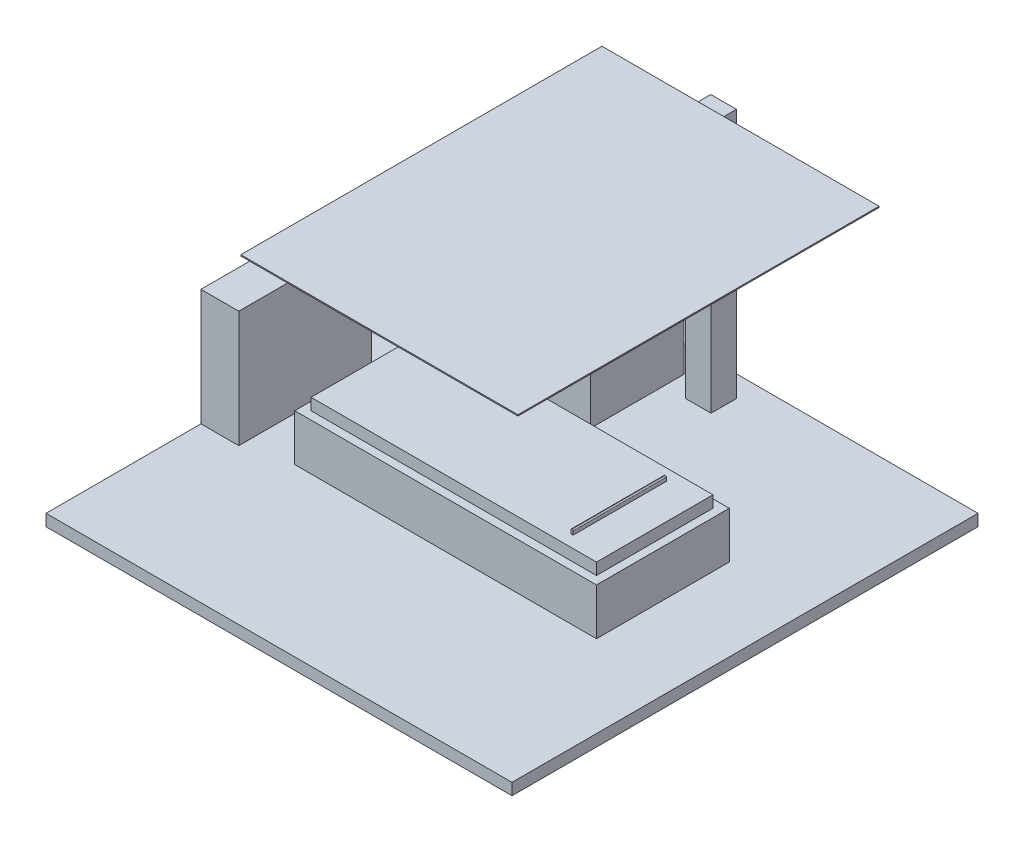
ISO-10303-21;
HEADER;
FILE_DESCRIPTION(('STEP AP214'),'2;1');
FILE_NAME('part.step','',(''),(''),'','','');
FILE_SCHEMA(('AUTOMOTIVE_DESIGN { 1 0 10303 214 1 1 1 1 }'));
ENDSEC;
DATA;
#1=APPLICATION_CONTEXT('core data for automotive mechanical design processes');
#2=APPLICATION_PROTOCOL_DEFINITION('international standard','automotive_design',2000,#1);
#3=PRODUCT_CONTEXT('',#1,'mechanical');
#4=PRODUCT('Part','Part','',(#3));
#5=PRODUCT_RELATED_PRODUCT_CATEGORY('part','',(#4));
#6=PRODUCT_DEFINITION_FORMATION('','',#4);
#7=PRODUCT_DEFINITION_CONTEXT('part definition',#1,'design');
#8=PRODUCT_DEFINITION('design','',#6,#7);
#9=PRODUCT_DEFINITION_SHAPE('','',#8);
#10=(LENGTH_UNIT() NAMED_UNIT(*) SI_UNIT(.MILLI.,.METRE.));
#11=(NAMED_UNIT(*) PLANE_ANGLE_UNIT() SI_UNIT($,.RADIAN.));
#12=(NAMED_UNIT(*) SI_UNIT($,.STERADIAN.) SOLID_ANGLE_UNIT());
#13=UNCERTAINTY_MEASURE_WITH_UNIT(LENGTH_MEASURE(1.E-05),#10,'distance_accuracy_value','');
#14=(GEOMETRIC_REPRESENTATION_CONTEXT(3) GLOBAL_UNCERTAINTY_ASSIGNED_CONTEXT((#13)) GLOBAL_UNIT_ASSIGNED_CONTEXT((#10,
#11,#12)) REPRESENTATION_CONTEXT('',''));
#15=CARTESIAN_POINT('',(0.,0.,0.));
#16=DIRECTION('',(0.,0.,1.));
#17=DIRECTION('',(1.,0.,0.));
#18=AXIS2_PLACEMENT_3D('',#15,#16,#17);
#19=CARTESIAN_POINT('',(0.,600.,0.));
#20=DIRECTION('',(0.,-1.,0.));
#21=DIRECTION('',(0.,0.,-1.));
#22=AXIS2_PLACEMENT_3D('',#19,#20,#21);
#23=PLANE('',#22);
#24=DIRECTION('',(0.,0.,-1.));
#25=VECTOR('',#24,1.);
#26=CARTESIAN_POINT('',(1225.,600.,500.));
#27=LINE('',#26,#25);
#28=CARTESIAN_POINT('',(1225.,600.,500.));
#29=VERTEX_POINT('',#28);
#30=CARTESIAN_POINT('',(1225.,600.,-500.));
#31=VERTEX_POINT('',#30);
#32=EDGE_CURVE('E420',#29,#31,#27,.T.);
#33=ORIENTED_EDGE('',*,*,#32,.T.);
#34=DIRECTION('',(-1.,0.,0.));
#35=VECTOR('',#34,1.);
#36=CARTESIAN_POINT('',(-1225.,600.,-500.));
#37=LINE('',#36,#35);
#38=CARTESIAN_POINT('',(-1225.,600.,-500.));
#39=VERTEX_POINT('',#38);
#40=EDGE_CURVE('E423',#31,#39,#37,.T.);
#41=ORIENTED_EDGE('',*,*,#40,.T.);
#42=DIRECTION('',(0.,0.,1.));
#43=VECTOR('',#42,1.);
#44=CARTESIAN_POINT('',(-1225.,600.,500.));
#45=LINE('',#44,#43);
#46=CARTESIAN_POINT('',(-1225.,600.,500.));
#47=VERTEX_POINT('',#46);
#48=EDGE_CURVE('E426',#39,#47,#45,.T.);
#49=ORIENTED_EDGE('',*,*,#48,.T.);
#50=DIRECTION('',(1.,0.,0.));
#51=VECTOR('',#50,1.);
#52=CARTESIAN_POINT('',(-1225.,600.,500.));
#53=LINE('',#52,#51);
#54=EDGE_CURVE('E428',#47,#29,#53,.T.);
#55=ORIENTED_EDGE('',*,*,#54,.T.);
#56=EDGE_LOOP('',(#33,#41,#49,#55));
#57=FACE_BOUND('',#56,.T.);
#58=DIRECTION('',(0.,0.,-1.));
#59=VECTOR('',#58,1.);
#60=CARTESIAN_POINT('',(925.,600.,-400.));
#61=LINE('',#60,#59);
#62=CARTESIAN_POINT('',(925.,600.,400.));
#63=VERTEX_POINT('',#62);
#64=CARTESIAN_POINT('',(925.,600.,-400.));
#65=VERTEX_POINT('',#64);
#66=EDGE_CURVE('E260',#63,#65,#61,.T.);
#67=ORIENTED_EDGE('',*,*,#66,.F.);
#68=DIRECTION('',(1.,0.,0.));
#69=VECTOR('',#68,1.);
#70=CARTESIAN_POINT('',(925.,600.,400.));
#71=LINE('',#70,#69);
#72=CARTESIAN_POINT('',(905.,600.,400.));
#73=VERTEX_POINT('',#72);
#74=EDGE_CURVE('E265',#73,#63,#71,.T.);
#75=ORIENTED_EDGE('',*,*,#74,.F.);
#76=DIRECTION('',(0.,0.,1.));
#77=VECTOR('',#76,1.);
#78=CARTESIAN_POINT('',(905.,600.,-400.));
#79=LINE('',#78,#77);
#80=CARTESIAN_POINT('',(905.,600.,-400.));
#81=VERTEX_POINT('',#80);
#82=EDGE_CURVE('E276',#81,#73,#79,.T.);
#83=ORIENTED_EDGE('',*,*,#82,.F.);
#84=DIRECTION('',(-1.,0.,0.));
#85=VECTOR('',#84,1.);
#86=CARTESIAN_POINT('',(925.,600.,-400.));
#87=LINE('',#86,#85);
#88=EDGE_CURVE('E273',#65,#81,#87,.T.);
#89=ORIENTED_EDGE('',*,*,#88,.F.);
#90=EDGE_LOOP('',(#67,#75,#83,#89));
#91=FACE_BOUND('',#90,.T.);
#92=ADVANCED_FACE('F38',(#57,#91),#23,.F.);
#93=CARTESIAN_POINT('',(0.,2250.,0.));
#94=DIRECTION('',(0.,1.,0.));
#95=DIRECTION('',(0.,0.,1.));
#96=AXIS2_PLACEMENT_3D('',#93,#94,#95);
#97=PLANE('',#96);
#98=DIRECTION('',(0.,0.,1.));
#99=VECTOR('',#98,1.);
#100=CARTESIAN_POINT('',(-110.276526212385,2250.,-1816.32419728227));
#101=LINE('',#100,#99);
#102=CARTESIAN_POINT('',(-110.276526212385,2250.,-1816.32419728227));
#103=VERTEX_POINT('',#102);
#104=CARTESIAN_POINT('',(-110.276526212385,2250.,-1698.22211195436));
#105=VERTEX_POINT('',#104);
#106=EDGE_CURVE('E328',#103,#105,#101,.T.);
#107=ORIENTED_EDGE('',*,*,#106,.T.);
#108=DIRECTION('',(1.,0.,0.));
#109=VECTOR('',#108,1.);
#110=CARTESIAN_POINT('',(1452.73793324483,2250.,-1698.22211195436));
#111=LINE('',#110,#109);
#112=CARTESIAN_POINT('',(110.276526212385,2250.,-1698.22211195436));
#113=VERTEX_POINT('',#112);
#114=EDGE_CURVE('E312',#105,#113,#111,.T.);
#115=ORIENTED_EDGE('',*,*,#114,.T.);
#116=DIRECTION('',(0.,0.,-1.));
#117=VECTOR('',#116,1.);
#118=CARTESIAN_POINT('',(110.276526212385,2250.,-1816.32419728227));
#119=LINE('',#118,#117);
#120=CARTESIAN_POINT('',(110.276526212385,2250.,-1816.32419728227));
#121=VERTEX_POINT('',#120);
#122=EDGE_CURVE('E325',#113,#121,#119,.T.);
#123=ORIENTED_EDGE('',*,*,#122,.T.);
#124=DIRECTION('',(-1.,0.,0.));
#125=VECTOR('',#124,1.);
#126=CARTESIAN_POINT('',(-110.276526212385,2250.,-1816.32419728227));
#127=LINE('',#126,#125);
#128=EDGE_CURVE('E324',#121,#103,#127,.T.);
#129=ORIENTED_EDGE('',*,*,#128,.T.);
#130=EDGE_LOOP('',(#107,#115,#123,#129));
#131=FACE_BOUND('',#130,.T.);
#132=ADVANCED_FACE('F544',(#131),#97,.T.);
#133=CARTESIAN_POINT('',(0.,100.,0.));
#134=DIRECTION('',(0.,-1.,0.));
#135=DIRECTION('',(0.,0.,-1.));
#136=AXIS2_PLACEMENT_3D('',#133,#134,#135);
#137=PLANE('',#136);
#138=DIRECTION('',(1.,0.,0.));
#139=VECTOR('',#138,1.);
#140=CARTESIAN_POINT('',(-1675.,100.,670.));
#141=LINE('',#140,#139);
#142=CARTESIAN_POINT('',(-2000.,100.,670.));
#143=VERTEX_POINT('',#142);
#144=CARTESIAN_POINT('',(-1675.,100.,670.));
#145=VERTEX_POINT('',#144);
#146=EDGE_CURVE('E356',#143,#145,#141,.T.);
#147=ORIENTED_EDGE('',*,*,#146,.F.);
#148=DIRECTION('',(0.,0.,1.));
#149=VECTOR('',#148,1.);
#150=CARTESIAN_POINT('',(-2000.,100.,2000.));
#151=LINE('',#150,#149);
#152=CARTESIAN_POINT('',(-2000.,100.,2000.));
#153=VERTEX_POINT('',#152);
#154=EDGE_CURVE('E492',#143,#153,#151,.T.);
#155=ORIENTED_EDGE('',*,*,#154,.T.);
#156=DIRECTION('',(1.,0.,0.));
#157=VECTOR('',#156,1.);
#158=CARTESIAN_POINT('',(-2000.,100.,2000.));
#159=LINE('',#158,#157);
#160=CARTESIAN_POINT('',(2000.,100.,2000.));
#161=VERTEX_POINT('',#160);
#162=EDGE_CURVE('E495',#153,#161,#159,.T.);
#163=ORIENTED_EDGE('',*,*,#162,.T.);
#164=DIRECTION('',(0.,0.,-1.));
#165=VECTOR('',#164,1.);
#166=CARTESIAN_POINT('',(2000.,100.,2000.));
#167=LINE('',#166,#165);
#168=CARTESIAN_POINT('',(2000.,100.,-2000.));
#169=VERTEX_POINT('',#168);
#170=EDGE_CURVE('E486',#161,#169,#167,.T.);
#171=ORIENTED_EDGE('',*,*,#170,.T.);
#172=DIRECTION('',(-1.,0.,0.));
#173=VECTOR('',#172,1.);
#174=CARTESIAN_POINT('',(-2000.,100.,-2000.));
#175=LINE('',#174,#173);
#176=CARTESIAN_POINT('',(-2000.,100.,-2000.));
#177=VERTEX_POINT('',#176);
#178=EDGE_CURVE('E489',#169,#177,#175,.T.);
#179=ORIENTED_EDGE('',*,*,#178,.T.);
#180=CARTESIAN_POINT('',(-2000.,100.,-470.));
#181=VERTEX_POINT('',#180);
#182=EDGE_CURVE('E493',#177,#181,#151,.T.);
#183=ORIENTED_EDGE('',*,*,#182,.T.);
#184=DIRECTION('',(-1.,0.,0.));
#185=VECTOR('',#184,1.);
#186=CARTESIAN_POINT('',(-1675.,100.,-470.));
#187=LINE('',#186,#185);
#188=CARTESIAN_POINT('',(-1675.,100.,-470.));
#189=VERTEX_POINT('',#188);
#190=EDGE_CURVE('E361',#189,#181,#187,.T.);
#191=ORIENTED_EDGE('',*,*,#190,.F.);
#192=DIRECTION('',(0.,0.,-1.));
#193=VECTOR('',#192,1.);
#194=CARTESIAN_POINT('',(-1675.,100.,670.));
#195=LINE('',#194,#193);
#196=EDGE_CURVE('E370',#145,#189,#195,.T.);
#197=ORIENTED_EDGE('',*,*,#196,.F.);
#198=EDGE_LOOP('',(#147,#155,#163,#171,#179,#183,#191,#197));
#199=FACE_BOUND('',#198,.T.);
#200=DIRECTION('',(0.,0.,-1.));
#201=VECTOR('',#200,1.);
#202=CARTESIAN_POINT('',(1295.,100.,570.));
#203=LINE('',#202,#201);
#204=CARTESIAN_POINT('',(1295.,100.,570.));
#205=VERTEX_POINT('',#204);
#206=CARTESIAN_POINT('',(1295.,100.,-570.));
#207=VERTEX_POINT('',#206);
#208=EDGE_CURVE('E452',#205,#207,#203,.T.);
#209=ORIENTED_EDGE('',*,*,#208,.F.);
#210=DIRECTION('',(1.,0.,0.));
#211=VECTOR('',#210,1.);
#212=CARTESIAN_POINT('',(-1295.,100.,570.));
#213=LINE('',#212,#211);
#214=CARTESIAN_POINT('',(-1295.,100.,570.));
#215=VERTEX_POINT('',#214);
#216=EDGE_CURVE('E457',#215,#205,#213,.T.);
#217=ORIENTED_EDGE('',*,*,#216,.F.);
#218=DIRECTION('',(0.,0.,1.));
#219=VECTOR('',#218,1.);
#220=CARTESIAN_POINT('',(-1295.,100.,570.));
#221=LINE('',#220,#219);
#222=CARTESIAN_POINT('',(-1295.,100.,-570.));
#223=VERTEX_POINT('',#222);
#224=EDGE_CURVE('E469',#223,#215,#221,.T.);
#225=ORIENTED_EDGE('',*,*,#224,.F.);
#226=DIRECTION('',(-1.,0.,0.));
#227=VECTOR('',#226,1.);
#228=CARTESIAN_POINT('',(-1295.,100.,-570.));
#229=LINE('',#228,#227);
#230=EDGE_CURVE('E466',#207,#223,#229,.T.);
#231=ORIENTED_EDGE('',*,*,#230,.F.);
#232=EDGE_LOOP('',(#209,#217,#225,#231));
#233=FACE_BOUND('',#232,.T.);
#234=DIRECTION('',(0.,0.,-1.));
#235=VECTOR('',#234,1.);
#236=CARTESIAN_POINT('',(-295.,100.,-970.));
#237=LINE('',#236,#235);
#238=CARTESIAN_POINT('',(-295.,100.,-970.));
#239=VERTEX_POINT('',#238);
#240=CARTESIAN_POINT('',(-295.,100.,-1770.));
#241=VERTEX_POINT('',#240);
#242=EDGE_CURVE('E386',#239,#241,#237,.T.);
#243=ORIENTED_EDGE('',*,*,#242,.F.);
#244=DIRECTION('',(1.,0.,0.));
#245=VECTOR('',#244,1.);
#246=CARTESIAN_POINT('',(-1295.,100.,-970.));
#247=LINE('',#246,#245);
#248=CARTESIAN_POINT('',(-1295.,100.,-970.));
#249=VERTEX_POINT('',#248);
#250=EDGE_CURVE('E391',#249,#239,#247,.T.);
#251=ORIENTED_EDGE('',*,*,#250,.F.);
#252=DIRECTION('',(0.,0.,1.));
#253=VECTOR('',#252,1.);
#254=CARTESIAN_POINT('',(-1295.,100.,-970.));
#255=LINE('',#254,#253);
#256=CARTESIAN_POINT('',(-1295.,100.,-1770.));
#257=VERTEX_POINT('',#256);
#258=EDGE_CURVE('E403',#257,#249,#255,.T.);
#259=ORIENTED_EDGE('',*,*,#258,.F.);
#260=DIRECTION('',(-1.,0.,0.));
#261=VECTOR('',#260,1.);
#262=CARTESIAN_POINT('',(-1295.,100.,-1770.));
#263=LINE('',#262,#261);
#264=EDGE_CURVE('E400',#241,#257,#263,.T.);
#265=ORIENTED_EDGE('',*,*,#264,.F.);
#266=EDGE_LOOP('',(#243,#251,#259,#265));
#267=FACE_BOUND('',#266,.T.);
#268=DIRECTION('',(0.,0.,-1.));
#269=VECTOR('',#268,1.);
#270=CARTESIAN_POINT('',(110.276526212385,100.,-1816.32419728227));
#271=LINE('',#270,#269);
#272=CARTESIAN_POINT('',(110.276526212385,100.,-1598.22211195436));
#273=VERTEX_POINT('',#272);
#274=CARTESIAN_POINT('',(110.276526212385,100.,-1816.32419728227));
#275=VERTEX_POINT('',#274);
#276=EDGE_CURVE('E315',#273,#275,#271,.T.);
#277=ORIENTED_EDGE('',*,*,#276,.F.);
#278=DIRECTION('',(1.,0.,0.));
#279=VECTOR('',#278,1.);
#280=CARTESIAN_POINT('',(-110.276526212385,100.,-1598.22211195436));
#281=LINE('',#280,#279);
#282=CARTESIAN_POINT('',(-110.276526212385,100.,-1598.22211195436));
#283=VERTEX_POINT('',#282);
#284=EDGE_CURVE('E342',#283,#273,#281,.T.);
#285=ORIENTED_EDGE('',*,*,#284,.F.);
#286=DIRECTION('',(0.,0.,1.));
#287=VECTOR('',#286,1.);
#288=CARTESIAN_POINT('',(-110.276526212385,100.,-1816.32419728227));
#289=LINE('',#288,#287);
#290=CARTESIAN_POINT('',(-110.276526212385,100.,-1816.32419728227));
#291=VERTEX_POINT('',#290);
#292=EDGE_CURVE('E339',#291,#283,#289,.T.);
#293=ORIENTED_EDGE('',*,*,#292,.F.);
#294=DIRECTION('',(-1.,0.,0.));
#295=VECTOR('',#294,1.);
#296=CARTESIAN_POINT('',(-110.276526212385,100.,-1816.32419728227));
#297=LINE('',#296,#295);
#298=EDGE_CURVE('E336',#275,#291,#297,.T.);
#299=ORIENTED_EDGE('',*,*,#298,.F.);
#300=EDGE_LOOP('',(#277,#285,#293,#299));
#301=FACE_BOUND('',#300,.T.);
#302=ADVANCED_FACE('F550',(#199,#233,#267,#301),#137,.F.);
#303=CARTESIAN_POINT('',(0.,500.,0.));
#304=DIRECTION('',(0.,-1.,0.));
#305=DIRECTION('',(0.,0.,-1.));
#306=AXIS2_PLACEMENT_3D('',#303,#304,#305);
#307=PLANE('',#306);
#308=DIRECTION('',(0.,0.,-1.));
#309=VECTOR('',#308,1.);
#310=CARTESIAN_POINT('',(1295.,500.,570.));
#311=LINE('',#310,#309);
#312=CARTESIAN_POINT('',(1295.,500.,570.));
#313=VERTEX_POINT('',#312);
#314=CARTESIAN_POINT('',(1295.,500.,-570.));
#315=VERTEX_POINT('',#314);
#316=EDGE_CURVE('E453',#313,#315,#311,.T.);
#317=ORIENTED_EDGE('',*,*,#316,.T.);
#318=DIRECTION('',(-1.,0.,0.));
#319=VECTOR('',#318,1.);
#320=CARTESIAN_POINT('',(-1295.,500.,-570.));
#321=LINE('',#320,#319);
#322=CARTESIAN_POINT('',(-1295.,500.,-570.));
#323=VERTEX_POINT('',#322);
#324=EDGE_CURVE('E456',#315,#323,#321,.T.);
#325=ORIENTED_EDGE('',*,*,#324,.T.);
#326=DIRECTION('',(0.,0.,1.));
#327=VECTOR('',#326,1.);
#328=CARTESIAN_POINT('',(-1295.,500.,570.));
#329=LINE('',#328,#327);
#330=CARTESIAN_POINT('',(-1295.,500.,570.));
#331=VERTEX_POINT('',#330);
#332=EDGE_CURVE('E459',#323,#331,#329,.T.);
#333=ORIENTED_EDGE('',*,*,#332,.T.);
#334=DIRECTION('',(1.,0.,0.));
#335=VECTOR('',#334,1.);
#336=CARTESIAN_POINT('',(-1295.,500.,570.));
#337=LINE('',#336,#335);
#338=EDGE_CURVE('E461',#331,#313,#337,.T.);
#339=ORIENTED_EDGE('',*,*,#338,.T.);
#340=EDGE_LOOP('',(#317,#325,#333,#339));
#341=FACE_BOUND('',#340,.T.);
#342=DIRECTION('',(0.,0.,-1.));
#343=VECTOR('',#342,1.);
#344=CARTESIAN_POINT('',(1225.,500.,500.));
#345=LINE('',#344,#343);
#346=CARTESIAN_POINT('',(1225.,500.,500.));
#347=VERTEX_POINT('',#346);
#348=CARTESIAN_POINT('',(1225.,500.,-500.));
#349=VERTEX_POINT('',#348);
#350=EDGE_CURVE('E419',#347,#349,#345,.T.);
#351=ORIENTED_EDGE('',*,*,#350,.F.);
#352=DIRECTION('',(1.,0.,0.));
#353=VECTOR('',#352,1.);
#354=CARTESIAN_POINT('',(-1225.,500.,500.));
#355=LINE('',#354,#353);
#356=CARTESIAN_POINT('',(-1225.,500.,500.));
#357=VERTEX_POINT('',#356);
#358=EDGE_CURVE('E424',#357,#347,#355,.T.);
#359=ORIENTED_EDGE('',*,*,#358,.F.);
#360=DIRECTION('',(0.,0.,1.));
#361=VECTOR('',#360,1.);
#362=CARTESIAN_POINT('',(-1225.,500.,500.));
#363=LINE('',#362,#361);
#364=CARTESIAN_POINT('',(-1225.,500.,-500.));
#365=VERTEX_POINT('',#364);
#366=EDGE_CURVE('E436',#365,#357,#363,.T.);
#367=ORIENTED_EDGE('',*,*,#366,.F.);
#368=DIRECTION('',(-1.,0.,0.));
#369=VECTOR('',#368,1.);
#370=CARTESIAN_POINT('',(-1225.,500.,-500.));
#371=LINE('',#370,#369);
#372=EDGE_CURVE('E433',#349,#365,#371,.T.);
#373=ORIENTED_EDGE('',*,*,#372,.F.);
#374=EDGE_LOOP('',(#351,#359,#367,#373));
#375=FACE_BOUND('',#374,.T.);
#376=ADVANCED_FACE('F574',(#341,#375),#307,.F.);
#377=CARTESIAN_POINT('',(2000.,100.,2000.));
#378=DIRECTION('',(-1.,0.,0.));
#379=DIRECTION('',(0.,0.,1.));
#380=AXIS2_PLACEMENT_3D('',#377,#378,#379);
#381=PLANE('',#380);
#382=DIRECTION('',(0.,0.,-1.));
#383=VECTOR('',#382,1.);
#384=CARTESIAN_POINT('',(2000.,0.,2000.));
#385=LINE('',#384,#383);
#386=CARTESIAN_POINT('',(2000.,0.,2000.));
#387=VERTEX_POINT('',#386);
#388=CARTESIAN_POINT('',(2000.,0.,-2000.));
#389=VERTEX_POINT('',#388);
#390=EDGE_CURVE('E485',#387,#389,#385,.T.);
#391=ORIENTED_EDGE('',*,*,#390,.T.);
#392=DIRECTION('',(0.,-1.,0.));
#393=VECTOR('',#392,1.);
#394=CARTESIAN_POINT('',(2000.,100.,-2000.));
#395=LINE('',#394,#393);
#396=EDGE_CURVE('E513',#169,#389,#395,.T.);
#397=ORIENTED_EDGE('',*,*,#396,.F.);
#398=ORIENTED_EDGE('',*,*,#170,.F.);
#399=DIRECTION('',(0.,-1.,0.));
#400=VECTOR('',#399,1.);
#401=CARTESIAN_POINT('',(2000.,100.,2000.));
#402=LINE('',#401,#400);
#403=EDGE_CURVE('E497',#161,#387,#402,.T.);
#404=ORIENTED_EDGE('',*,*,#403,.T.);
#405=EDGE_LOOP('',(#391,#397,#398,#404));
#406=FACE_BOUND('',#405,.T.);
#407=ADVANCED_FACE('F577',(#406),#381,.F.);
#408=CARTESIAN_POINT('',(-2000.,100.,-2000.));
#409=DIRECTION('',(0.,0.,1.));
#410=DIRECTION('',(1.,0.,0.));
#411=AXIS2_PLACEMENT_3D('',#408,#409,#410);
#412=PLANE('',#411);
#413=DIRECTION('',(-1.,0.,0.));
#414=VECTOR('',#413,1.);
#415=CARTESIAN_POINT('',(-2000.,0.,-2000.));
#416=LINE('',#415,#414);
#417=CARTESIAN_POINT('',(-2000.,0.,-2000.));
#418=VERTEX_POINT('',#417);
#419=EDGE_CURVE('E500',#389,#418,#416,.T.);
#420=ORIENTED_EDGE('',*,*,#419,.T.);
#421=DIRECTION('',(0.,-1.,0.));
#422=VECTOR('',#421,1.);
#423=CARTESIAN_POINT('',(-2000.,100.,-2000.));
#424=LINE('',#423,#422);
#425=EDGE_CURVE('E510',#177,#418,#424,.T.);
#426=ORIENTED_EDGE('',*,*,#425,.F.);
#427=ORIENTED_EDGE('',*,*,#178,.F.);
#428=ORIENTED_EDGE('',*,*,#396,.T.);
#429=EDGE_LOOP('',(#420,#426,#427,#428));
#430=FACE_BOUND('',#429,.T.);
#431=ADVANCED_FACE('F608',(#430),#412,.F.);
#432=CARTESIAN_POINT('',(-2000.,100.,2000.));
#433=DIRECTION('',(1.,0.,0.));
#434=DIRECTION('',(0.,0.,-1.));
#435=AXIS2_PLACEMENT_3D('',#432,#433,#434);
#436=PLANE('',#435);
#437=DIRECTION('',(0.,0.,1.));
#438=VECTOR('',#437,1.);
#439=CARTESIAN_POINT('',(-2000.,0.,2000.));
#440=LINE('',#439,#438);
#441=CARTESIAN_POINT('',(-2000.,0.,2000.));
#442=VERTEX_POINT('',#441);
#443=EDGE_CURVE('E502',#418,#442,#440,.T.);
#444=ORIENTED_EDGE('',*,*,#443,.T.);
#445=DIRECTION('',(0.,-1.,0.));
#446=VECTOR('',#445,1.);
#447=CARTESIAN_POINT('',(-2000.,100.,2000.));
#448=LINE('',#447,#446);
#449=EDGE_CURVE('E507',#153,#442,#448,.T.);
#450=ORIENTED_EDGE('',*,*,#449,.F.);
#451=ORIENTED_EDGE('',*,*,#154,.F.);
#452=DIRECTION('',(0.,-1.,0.));
#453=VECTOR('',#452,1.);
#454=CARTESIAN_POINT('',(-2000.,1100.,670.));
#455=LINE('',#454,#453);
#456=CARTESIAN_POINT('',(-2000.,1100.,670.));
#457=VERTEX_POINT('',#456);
#458=EDGE_CURVE('E383',#457,#143,#455,.T.);
#459=ORIENTED_EDGE('',*,*,#458,.F.);
#460=DIRECTION('',(0.,0.,1.));
#461=VECTOR('',#460,1.);
#462=CARTESIAN_POINT('',(-2000.,1100.,670.));
#463=LINE('',#462,#461);
#464=CARTESIAN_POINT('',(-2000.,1100.,-470.));
#465=VERTEX_POINT('',#464);
#466=EDGE_CURVE('E357',#465,#457,#463,.T.);
#467=ORIENTED_EDGE('',*,*,#466,.F.);
#468=DIRECTION('',(0.,-1.,0.));
#469=VECTOR('',#468,1.);
#470=CARTESIAN_POINT('',(-2000.,1100.,-470.));
#471=LINE('',#470,#469);
#472=EDGE_CURVE('E367',#465,#181,#471,.T.);
#473=ORIENTED_EDGE('',*,*,#472,.T.);
#474=ORIENTED_EDGE('',*,*,#182,.F.);
#475=ORIENTED_EDGE('',*,*,#425,.T.);
#476=EDGE_LOOP('',(#444,#450,#451,#459,#467,#473,#474,#475));
#477=FACE_BOUND('',#476,.T.);
#478=ADVANCED_FACE('F604',(#477),#436,.F.);
#479=CARTESIAN_POINT('',(-2000.,100.,2000.));
#480=DIRECTION('',(0.,0.,-1.));
#481=DIRECTION('',(-1.,0.,0.));
#482=AXIS2_PLACEMENT_3D('',#479,#480,#481);
#483=PLANE('',#482);
#484=DIRECTION('',(1.,0.,0.));
#485=VECTOR('',#484,1.);
#486=CARTESIAN_POINT('',(-2000.,0.,2000.));
#487=LINE('',#486,#485);
#488=EDGE_CURVE('E490',#442,#387,#487,.T.);
#489=ORIENTED_EDGE('',*,*,#488,.T.);
#490=ORIENTED_EDGE('',*,*,#403,.F.);
#491=ORIENTED_EDGE('',*,*,#162,.F.);
#492=ORIENTED_EDGE('',*,*,#449,.T.);
#493=EDGE_LOOP('',(#489,#490,#491,#492));
#494=FACE_BOUND('',#493,.T.);
#495=ADVANCED_FACE('F600',(#494),#483,.F.);
#496=CARTESIAN_POINT('',(0.,0.,0.));
#497=DIRECTION('',(0.,-1.,0.));
#498=DIRECTION('',(0.,0.,-1.));
#499=AXIS2_PLACEMENT_3D('',#496,#497,#498);
#500=PLANE('',#499);
#501=ORIENTED_EDGE('',*,*,#390,.F.);
#502=ORIENTED_EDGE('',*,*,#488,.F.);
#503=ORIENTED_EDGE('',*,*,#443,.F.);
#504=ORIENTED_EDGE('',*,*,#419,.F.);
#505=EDGE_LOOP('',(#501,#502,#503,#504));
#506=FACE_BOUND('',#505,.T.);
#507=ADVANCED_FACE('F593',(#506),#500,.T.);
#508=CARTESIAN_POINT('',(1295.,500.,570.));
#509=DIRECTION('',(-1.,0.,0.));
#510=DIRECTION('',(0.,0.,1.));
#511=AXIS2_PLACEMENT_3D('',#508,#509,#510);
#512=PLANE('',#511);
#513=ORIENTED_EDGE('',*,*,#208,.T.);
#514=DIRECTION('',(0.,-1.,0.));
#515=VECTOR('',#514,1.);
#516=CARTESIAN_POINT('',(1295.,500.,-570.));
#517=LINE('',#516,#515);
#518=EDGE_CURVE('E482',#315,#207,#517,.T.);
#519=ORIENTED_EDGE('',*,*,#518,.F.);
#520=ORIENTED_EDGE('',*,*,#316,.F.);
#521=DIRECTION('',(0.,-1.,0.));
#522=VECTOR('',#521,1.);
#523=CARTESIAN_POINT('',(1295.,500.,570.));
#524=LINE('',#523,#522);
#525=EDGE_CURVE('E463',#313,#205,#524,.T.);
#526=ORIENTED_EDGE('',*,*,#525,.T.);
#527=EDGE_LOOP('',(#513,#519,#520,#526));
#528=FACE_BOUND('',#527,.T.);
#529=ADVANCED_FACE('F589',(#528),#512,.F.);
#530=CARTESIAN_POINT('',(-1295.,500.,-570.));
#531=DIRECTION('',(0.,0.,1.));
#532=DIRECTION('',(1.,0.,0.));
#533=AXIS2_PLACEMENT_3D('',#530,#531,#532);
#534=PLANE('',#533);
#535=ORIENTED_EDGE('',*,*,#230,.T.);
#536=DIRECTION('',(0.,-1.,0.));
#537=VECTOR('',#536,1.);
#538=CARTESIAN_POINT('',(-1295.,500.,-570.));
#539=LINE('',#538,#537);
#540=EDGE_CURVE('E479',#323,#223,#539,.T.);
#541=ORIENTED_EDGE('',*,*,#540,.F.);
#542=ORIENTED_EDGE('',*,*,#324,.F.);
#543=ORIENTED_EDGE('',*,*,#518,.T.);
#544=EDGE_LOOP('',(#535,#541,#542,#543));
#545=FACE_BOUND('',#544,.T.);
#546=ADVANCED_FACE('F585',(#545),#534,.F.);
#547=CARTESIAN_POINT('',(-1295.,500.,570.));
#548=DIRECTION('',(1.,0.,0.));
#549=DIRECTION('',(0.,0.,-1.));
#550=AXIS2_PLACEMENT_3D('',#547,#548,#549);
#551=PLANE('',#550);
#552=ORIENTED_EDGE('',*,*,#224,.T.);
#553=DIRECTION('',(0.,-1.,0.));
#554=VECTOR('',#553,1.);
#555=CARTESIAN_POINT('',(-1295.,500.,570.));
#556=LINE('',#555,#554);
#557=EDGE_CURVE('E476',#331,#215,#556,.T.);
#558=ORIENTED_EDGE('',*,*,#557,.F.);
#559=ORIENTED_EDGE('',*,*,#332,.F.);
#560=ORIENTED_EDGE('',*,*,#540,.T.);
#561=EDGE_LOOP('',(#552,#558,#559,#560));
#562=FACE_BOUND('',#561,.T.);
#563=ADVANCED_FACE('F581',(#562),#551,.F.);
#564=CARTESIAN_POINT('',(-1295.,500.,570.));
#565=DIRECTION('',(0.,0.,-1.));
#566=DIRECTION('',(-1.,0.,0.));
#567=AXIS2_PLACEMENT_3D('',#564,#565,#566);
#568=PLANE('',#567);
#569=ORIENTED_EDGE('',*,*,#216,.T.);
#570=ORIENTED_EDGE('',*,*,#525,.F.);
#571=ORIENTED_EDGE('',*,*,#338,.F.);
#572=ORIENTED_EDGE('',*,*,#557,.T.);
#573=EDGE_LOOP('',(#569,#570,#571,#572));
#574=FACE_BOUND('',#573,.T.);
#575=ADVANCED_FACE('F572',(#574),#568,.F.);
#576=CARTESIAN_POINT('',(1225.,600.,500.));
#577=DIRECTION('',(-1.,0.,0.));
#578=DIRECTION('',(0.,0.,1.));
#579=AXIS2_PLACEMENT_3D('',#576,#577,#578);
#580=PLANE('',#579);
#581=ORIENTED_EDGE('',*,*,#350,.T.);
#582=DIRECTION('',(0.,-1.,0.));
#583=VECTOR('',#582,1.);
#584=CARTESIAN_POINT('',(1225.,600.,-500.));
#585=LINE('',#584,#583);
#586=EDGE_CURVE('E449',#31,#349,#585,.T.);
#587=ORIENTED_EDGE('',*,*,#586,.F.);
#588=ORIENTED_EDGE('',*,*,#32,.F.);
#589=DIRECTION('',(0.,-1.,0.));
#590=VECTOR('',#589,1.);
#591=CARTESIAN_POINT('',(1225.,600.,500.));
#592=LINE('',#591,#590);
#593=EDGE_CURVE('E430',#29,#347,#592,.T.);
#594=ORIENTED_EDGE('',*,*,#593,.T.);
#595=EDGE_LOOP('',(#581,#587,#588,#594));
#596=FACE_BOUND('',#595,.T.);
#597=ADVANCED_FACE('F568',(#596),#580,.F.);
#598=CARTESIAN_POINT('',(-1225.,600.,-500.));
#599=DIRECTION('',(0.,0.,1.));
#600=DIRECTION('',(1.,0.,0.));
#601=AXIS2_PLACEMENT_3D('',#598,#599,#600);
#602=PLANE('',#601);
#603=ORIENTED_EDGE('',*,*,#372,.T.);
#604=DIRECTION('',(0.,-1.,0.));
#605=VECTOR('',#604,1.);
#606=CARTESIAN_POINT('',(-1225.,600.,-500.));
#607=LINE('',#606,#605);
#608=EDGE_CURVE('E446',#39,#365,#607,.T.);
#609=ORIENTED_EDGE('',*,*,#608,.F.);
#610=ORIENTED_EDGE('',*,*,#40,.F.);
#611=ORIENTED_EDGE('',*,*,#586,.T.);
#612=EDGE_LOOP('',(#603,#609,#610,#611));
#613=FACE_BOUND('',#612,.T.);
#614=ADVANCED_FACE('F564',(#613),#602,.F.);
#615=CARTESIAN_POINT('',(-1225.,600.,500.));
#616=DIRECTION('',(1.,0.,0.));
#617=DIRECTION('',(0.,0.,-1.));
#618=AXIS2_PLACEMENT_3D('',#615,#616,#617);
#619=PLANE('',#618);
#620=ORIENTED_EDGE('',*,*,#366,.T.);
#621=DIRECTION('',(0.,-1.,0.));
#622=VECTOR('',#621,1.);
#623=CARTESIAN_POINT('',(-1225.,600.,500.));
#624=LINE('',#623,#622);
#625=EDGE_CURVE('E443',#47,#357,#624,.T.);
#626=ORIENTED_EDGE('',*,*,#625,.F.);
#627=ORIENTED_EDGE('',*,*,#48,.F.);
#628=ORIENTED_EDGE('',*,*,#608,.T.);
#629=EDGE_LOOP('',(#620,#626,#627,#628));
#630=FACE_BOUND('',#629,.T.);
#631=ADVANCED_FACE('F560',(#630),#619,.F.);
#632=CARTESIAN_POINT('',(-1225.,600.,500.));
#633=DIRECTION('',(0.,0.,-1.));
#634=DIRECTION('',(-1.,0.,0.));
#635=AXIS2_PLACEMENT_3D('',#632,#633,#634);
#636=PLANE('',#635);
#637=ORIENTED_EDGE('',*,*,#358,.T.);
#638=ORIENTED_EDGE('',*,*,#593,.F.);
#639=ORIENTED_EDGE('',*,*,#54,.F.);
#640=ORIENTED_EDGE('',*,*,#625,.T.);
#641=EDGE_LOOP('',(#637,#638,#639,#640));
#642=FACE_BOUND('',#641,.T.);
#643=ADVANCED_FACE('F557',(#642),#636,.F.);
#644=CARTESIAN_POINT('',(-295.,1100.,-970.));
#645=DIRECTION('',(-1.,0.,0.));
#646=DIRECTION('',(0.,0.,1.));
#647=AXIS2_PLACEMENT_3D('',#644,#645,#646);
#648=PLANE('',#647);
#649=ORIENTED_EDGE('',*,*,#242,.T.);
#650=DIRECTION('',(0.,-1.,0.));
#651=VECTOR('',#650,1.);
#652=CARTESIAN_POINT('',(-295.,1100.,-1770.));
#653=LINE('',#652,#651);
#654=CARTESIAN_POINT('',(-295.,1100.,-1770.));
#655=VERTEX_POINT('',#654);
#656=EDGE_CURVE('E416',#655,#241,#653,.T.);
#657=ORIENTED_EDGE('',*,*,#656,.F.);
#658=DIRECTION('',(0.,0.,-1.));
#659=VECTOR('',#658,1.);
#660=CARTESIAN_POINT('',(-295.,1100.,-970.));
#661=LINE('',#660,#659);
#662=CARTESIAN_POINT('',(-295.,1100.,-970.));
#663=VERTEX_POINT('',#662);
#664=EDGE_CURVE('E387',#663,#655,#661,.T.);
#665=ORIENTED_EDGE('',*,*,#664,.F.);
#666=DIRECTION('',(0.,-1.,0.));
#667=VECTOR('',#666,1.);
#668=CARTESIAN_POINT('',(-295.,1100.,-970.));
#669=LINE('',#668,#667);
#670=EDGE_CURVE('E397',#663,#239,#669,.T.);
#671=ORIENTED_EDGE('',*,*,#670,.T.);
#672=EDGE_LOOP('',(#649,#657,#665,#671));
#673=FACE_BOUND('',#672,.T.);
#674=ADVANCED_FACE('F555',(#673),#648,.F.);
#675=CARTESIAN_POINT('',(-1295.,1100.,-1770.));
#676=DIRECTION('',(0.,0.,1.));
#677=DIRECTION('',(1.,0.,0.));
#678=AXIS2_PLACEMENT_3D('',#675,#676,#677);
#679=PLANE('',#678);
#680=ORIENTED_EDGE('',*,*,#264,.T.);
#681=DIRECTION('',(0.,-1.,0.));
#682=VECTOR('',#681,1.);
#683=CARTESIAN_POINT('',(-1295.,1100.,-1770.));
#684=LINE('',#683,#682);
#685=CARTESIAN_POINT('',(-1295.,1100.,-1770.));
#686=VERTEX_POINT('',#685);
#687=EDGE_CURVE('E413',#686,#257,#684,.T.);
#688=ORIENTED_EDGE('',*,*,#687,.F.);
#689=DIRECTION('',(-1.,0.,0.));
#690=VECTOR('',#689,1.);
#691=CARTESIAN_POINT('',(-1295.,1100.,-1770.));
#692=LINE('',#691,#690);
#693=EDGE_CURVE('E390',#655,#686,#692,.T.);
#694=ORIENTED_EDGE('',*,*,#693,.F.);
#695=ORIENTED_EDGE('',*,*,#656,.T.);
#696=EDGE_LOOP('',(#680,#688,#694,#695));
#697=FACE_BOUND('',#696,.T.);
#698=ADVANCED_FACE('F829',(#697),#679,.F.);
#699=CARTESIAN_POINT('',(-1295.,1100.,-970.));
#700=DIRECTION('',(1.,0.,0.));
#701=DIRECTION('',(0.,0.,-1.));
#702=AXIS2_PLACEMENT_3D('',#699,#700,#701);
#703=PLANE('',#702);
#704=ORIENTED_EDGE('',*,*,#258,.T.);
#705=DIRECTION('',(0.,-1.,0.));
#706=VECTOR('',#705,1.);
#707=CARTESIAN_POINT('',(-1295.,1100.,-970.));
#708=LINE('',#707,#706);
#709=CARTESIAN_POINT('',(-1295.,1100.,-970.));
#710=VERTEX_POINT('',#709);
#711=EDGE_CURVE('E410',#710,#249,#708,.T.);
#712=ORIENTED_EDGE('',*,*,#711,.F.);
#713=DIRECTION('',(0.,0.,1.));
#714=VECTOR('',#713,1.);
#715=CARTESIAN_POINT('',(-1295.,1100.,-970.));
#716=LINE('',#715,#714);
#717=EDGE_CURVE('E393',#686,#710,#716,.T.);
#718=ORIENTED_EDGE('',*,*,#717,.F.);
#719=ORIENTED_EDGE('',*,*,#687,.T.);
#720=EDGE_LOOP('',(#704,#712,#718,#719));
#721=FACE_BOUND('',#720,.T.);
#722=ADVANCED_FACE('F819',(#721),#703,.F.);
#723=CARTESIAN_POINT('',(-1295.,1100.,-970.));
#724=DIRECTION('',(0.,0.,-1.));
#725=DIRECTION('',(-1.,0.,0.));
#726=AXIS2_PLACEMENT_3D('',#723,#724,#725);
#727=PLANE('',#726);
#728=ORIENTED_EDGE('',*,*,#250,.T.);
#729=ORIENTED_EDGE('',*,*,#670,.F.);
#730=DIRECTION('',(1.,0.,0.));
#731=VECTOR('',#730,1.);
#732=CARTESIAN_POINT('',(-1295.,1100.,-970.));
#733=LINE('',#732,#731);
#734=EDGE_CURVE('E395',#710,#663,#733,.T.);
#735=ORIENTED_EDGE('',*,*,#734,.F.);
#736=ORIENTED_EDGE('',*,*,#711,.T.);
#737=EDGE_LOOP('',(#728,#729,#735,#736));
#738=FACE_BOUND('',#737,.T.);
#739=ADVANCED_FACE('F809',(#738),#727,.F.);
#740=CARTESIAN_POINT('',(0.,1100.,0.));
#741=DIRECTION('',(0.,-1.,0.));
#742=DIRECTION('',(0.,0.,-1.));
#743=AXIS2_PLACEMENT_3D('',#740,#741,#742);
#744=PLANE('',#743);
#745=ORIENTED_EDGE('',*,*,#664,.T.);
#746=ORIENTED_EDGE('',*,*,#693,.T.);
#747=ORIENTED_EDGE('',*,*,#717,.T.);
#748=ORIENTED_EDGE('',*,*,#734,.T.);
#749=EDGE_LOOP('',(#745,#746,#747,#748));
#750=FACE_BOUND('',#749,.T.);
#751=ADVANCED_FACE('F799',(#750),#744,.F.);
#752=CARTESIAN_POINT('',(-1675.,1100.,670.));
#753=DIRECTION('',(0.,0.,-1.));
#754=DIRECTION('',(-1.,0.,0.));
#755=AXIS2_PLACEMENT_3D('',#752,#753,#754);
#756=PLANE('',#755);
#757=ORIENTED_EDGE('',*,*,#146,.T.);
#758=DIRECTION('',(0.,-1.,0.));
#759=VECTOR('',#758,1.);
#760=CARTESIAN_POINT('',(-1675.,1100.,670.));
#761=LINE('',#760,#759);
#762=CARTESIAN_POINT('',(-1675.,1100.,670.));
#763=VERTEX_POINT('',#762);
#764=EDGE_CURVE('E380',#763,#145,#761,.T.);
#765=ORIENTED_EDGE('',*,*,#764,.F.);
#766=DIRECTION('',(1.,0.,0.));
#767=VECTOR('',#766,1.);
#768=CARTESIAN_POINT('',(-1675.,1100.,670.));
#769=LINE('',#768,#767);
#770=EDGE_CURVE('E360',#457,#763,#769,.T.);
#771=ORIENTED_EDGE('',*,*,#770,.F.);
#772=ORIENTED_EDGE('',*,*,#458,.T.);
#773=EDGE_LOOP('',(#757,#765,#771,#772));
#774=FACE_BOUND('',#773,.T.);
#775=ADVANCED_FACE('F789',(#774),#756,.F.);
#776=CARTESIAN_POINT('',(-1675.,1100.,670.));
#777=DIRECTION('',(-1.,0.,0.));
#778=DIRECTION('',(0.,0.,1.));
#779=AXIS2_PLACEMENT_3D('',#776,#777,#778);
#780=PLANE('',#779);
#781=ORIENTED_EDGE('',*,*,#196,.T.);
#782=DIRECTION('',(0.,-1.,0.));
#783=VECTOR('',#782,1.);
#784=CARTESIAN_POINT('',(-1675.,1100.,-470.));
#785=LINE('',#784,#783);
#786=CARTESIAN_POINT('',(-1675.,1100.,-470.));
#787=VERTEX_POINT('',#786);
#788=EDGE_CURVE('E377',#787,#189,#785,.T.);
#789=ORIENTED_EDGE('',*,*,#788,.F.);
#790=DIRECTION('',(0.,0.,-1.));
#791=VECTOR('',#790,1.);
#792=CARTESIAN_POINT('',(-1675.,1100.,670.));
#793=LINE('',#792,#791);
#794=EDGE_CURVE('E363',#763,#787,#793,.T.);
#795=ORIENTED_EDGE('',*,*,#794,.F.);
#796=ORIENTED_EDGE('',*,*,#764,.T.);
#797=EDGE_LOOP('',(#781,#789,#795,#796));
#798=FACE_BOUND('',#797,.T.);
#799=ADVANCED_FACE('F779',(#798),#780,.F.);
#800=CARTESIAN_POINT('',(-1675.,1100.,-470.));
#801=DIRECTION('',(0.,0.,1.));
#802=DIRECTION('',(1.,0.,0.));
#803=AXIS2_PLACEMENT_3D('',#800,#801,#802);
#804=PLANE('',#803);
#805=ORIENTED_EDGE('',*,*,#190,.T.);
#806=ORIENTED_EDGE('',*,*,#472,.F.);
#807=DIRECTION('',(-1.,0.,0.));
#808=VECTOR('',#807,1.);
#809=CARTESIAN_POINT('',(-1675.,1100.,-470.));
#810=LINE('',#809,#808);
#811=EDGE_CURVE('E365',#787,#465,#810,.T.);
#812=ORIENTED_EDGE('',*,*,#811,.F.);
#813=ORIENTED_EDGE('',*,*,#788,.T.);
#814=EDGE_LOOP('',(#805,#806,#812,#813));
#815=FACE_BOUND('',#814,.T.);
#816=ADVANCED_FACE('F769',(#815),#804,.F.);
#817=CARTESIAN_POINT('',(0.,1100.,0.));
#818=DIRECTION('',(0.,1.,0.));
#819=DIRECTION('',(0.,0.,1.));
#820=AXIS2_PLACEMENT_3D('',#817,#818,#819);
#821=PLANE('',#820);
#822=ORIENTED_EDGE('',*,*,#466,.T.);
#823=ORIENTED_EDGE('',*,*,#770,.T.);
#824=ORIENTED_EDGE('',*,*,#794,.T.);
#825=ORIENTED_EDGE('',*,*,#811,.T.);
#826=EDGE_LOOP('',(#822,#823,#824,#825));
#827=FACE_BOUND('',#826,.T.);
#828=ADVANCED_FACE('F741',(#827),#821,.T.);
#829=CARTESIAN_POINT('',(110.276526212385,2250.,-1816.32419728227));
#830=DIRECTION('',(-1.,0.,0.));
#831=DIRECTION('',(0.,0.,1.));
#832=AXIS2_PLACEMENT_3D('',#829,#830,#831);
#833=PLANE('',#832);
#834=ORIENTED_EDGE('',*,*,#276,.T.);
#835=DIRECTION('',(0.,-1.,0.));
#836=VECTOR('',#835,1.);
#837=CARTESIAN_POINT('',(110.276526212385,2250.,-1816.32419728227));
#838=LINE('',#837,#836);
#839=EDGE_CURVE('E353',#121,#275,#838,.T.);
#840=ORIENTED_EDGE('',*,*,#839,.F.);
#841=ORIENTED_EDGE('',*,*,#122,.F.);
#842=CARTESIAN_POINT('',(110.276526212385,2250.,-1598.22211195436));
#843=VERTEX_POINT('',#842);
#844=EDGE_CURVE('E321',#843,#113,#119,.T.);
#845=ORIENTED_EDGE('',*,*,#844,.F.);
#846=DIRECTION('',(0.,-1.,0.));
#847=VECTOR('',#846,1.);
#848=CARTESIAN_POINT('',(110.276526212385,2250.,-1598.22211195436));
#849=LINE('',#848,#847);
#850=EDGE_CURVE('E333',#843,#273,#849,.T.);
#851=ORIENTED_EDGE('',*,*,#850,.T.);
#852=EDGE_LOOP('',(#834,#840,#841,#845,#851));
#853=FACE_BOUND('',#852,.T.);
#854=ADVANCED_FACE('F736',(#853),#833,.F.);
#855=CARTESIAN_POINT('',(-110.276526212385,2250.,-1816.32419728227));
#856=DIRECTION('',(0.,0.,1.));
#857=DIRECTION('',(1.,0.,0.));
#858=AXIS2_PLACEMENT_3D('',#855,#856,#857);
#859=PLANE('',#858);
#860=ORIENTED_EDGE('',*,*,#298,.T.);
#861=DIRECTION('',(0.,-1.,0.));
#862=VECTOR('',#861,1.);
#863=CARTESIAN_POINT('',(-110.276526212385,2250.,-1816.32419728227));
#864=LINE('',#863,#862);
#865=EDGE_CURVE('E350',#103,#291,#864,.T.);
#866=ORIENTED_EDGE('',*,*,#865,.F.);
#867=ORIENTED_EDGE('',*,*,#128,.F.);
#868=ORIENTED_EDGE('',*,*,#839,.T.);
#869=EDGE_LOOP('',(#860,#866,#867,#868));
#870=FACE_BOUND('',#869,.T.);
#871=ADVANCED_FACE('F728',(#870),#859,.F.);
#872=CARTESIAN_POINT('',(-110.276526212385,2250.,-1816.32419728227));
#873=DIRECTION('',(1.,0.,0.));
#874=DIRECTION('',(0.,0.,-1.));
#875=AXIS2_PLACEMENT_3D('',#872,#873,#874);
#876=PLANE('',#875);
#877=ORIENTED_EDGE('',*,*,#292,.T.);
#878=DIRECTION('',(0.,-1.,0.));
#879=VECTOR('',#878,1.);
#880=CARTESIAN_POINT('',(-110.276526212385,2250.,-1598.22211195436));
#881=LINE('',#880,#879);
#882=CARTESIAN_POINT('',(-110.276526212385,2250.,-1598.22211195436));
#883=VERTEX_POINT('',#882);
#884=EDGE_CURVE('E347',#883,#283,#881,.T.);
#885=ORIENTED_EDGE('',*,*,#884,.F.);
#886=EDGE_CURVE('E327',#105,#883,#101,.T.);
#887=ORIENTED_EDGE('',*,*,#886,.F.);
#888=ORIENTED_EDGE('',*,*,#106,.F.);
#889=ORIENTED_EDGE('',*,*,#865,.T.);
#890=EDGE_LOOP('',(#877,#885,#887,#888,#889));
#891=FACE_BOUND('',#890,.T.);
#892=ADVANCED_FACE('F718',(#891),#876,.F.);
#893=CARTESIAN_POINT('',(-110.276526212385,2250.,-1598.22211195436));
#894=DIRECTION('',(0.,0.,-1.));
#895=DIRECTION('',(-1.,0.,0.));
#896=AXIS2_PLACEMENT_3D('',#893,#894,#895);
#897=PLANE('',#896);
#898=ORIENTED_EDGE('',*,*,#284,.T.);
#899=ORIENTED_EDGE('',*,*,#850,.F.);
#900=DIRECTION('',(1.,0.,0.));
#901=VECTOR('',#900,1.);
#902=CARTESIAN_POINT('',(-110.276526212385,2250.,-1598.22211195436));
#903=LINE('',#902,#901);
#904=EDGE_CURVE('E331',#883,#843,#903,.T.);
#905=ORIENTED_EDGE('',*,*,#904,.F.);
#906=ORIENTED_EDGE('',*,*,#884,.T.);
#907=EDGE_LOOP('',(#898,#899,#905,#906));
#908=FACE_BOUND('',#907,.T.);
#909=ADVANCED_FACE('F707',(#908),#897,.F.);
#910=CARTESIAN_POINT('',(1452.73793324483,2250.,-1698.22211195436));
#911=DIRECTION('',(1.,0.,0.));
#912=DIRECTION('',(0.,0.,-1.));
#913=AXIS2_PLACEMENT_3D('',#910,#911,#912);
#914=PLANE('',#913);
#915=DIRECTION('',(0.,0.,1.));
#916=VECTOR('',#915,1.);
#917=CARTESIAN_POINT('',(1452.73793324483,2260.,-1698.22211195436));
#918=LINE('',#917,#916);
#919=CARTESIAN_POINT('',(1452.73793324483,2260.,-1698.22211195436));
#920=VERTEX_POINT('',#919);
#921=CARTESIAN_POINT('',(1452.73793324483,2260.,1401.77788804564));
#922=VERTEX_POINT('',#921);
#923=EDGE_CURVE('E311',#920,#922,#918,.T.);
#924=ORIENTED_EDGE('',*,*,#923,.T.);
#925=DIRECTION('',(0.,1.,0.));
#926=VECTOR('',#925,1.);
#927=CARTESIAN_POINT('',(1452.73793324483,2250.,1401.77788804564));
#928=LINE('',#927,#926);
#929=CARTESIAN_POINT('',(1452.73793324483,2250.,1401.77788804564));
#930=VERTEX_POINT('',#929);
#931=EDGE_CURVE('E286',#930,#922,#928,.T.);
#932=ORIENTED_EDGE('',*,*,#931,.F.);
#933=DIRECTION('',(0.,0.,1.));
#934=VECTOR('',#933,1.);
#935=CARTESIAN_POINT('',(1452.73793324483,2250.,-1698.22211195436));
#936=LINE('',#935,#934);
#937=CARTESIAN_POINT('',(1452.73793324483,2250.,-1698.22211195436));
#938=VERTEX_POINT('',#937);
#939=EDGE_CURVE('E313',#938,#930,#936,.T.);
#940=ORIENTED_EDGE('',*,*,#939,.F.);
#941=DIRECTION('',(0.,1.,0.));
#942=VECTOR('',#941,1.);
#943=CARTESIAN_POINT('',(1452.73793324483,2250.,-1698.22211195436));
#944=LINE('',#943,#942);
#945=EDGE_CURVE('E298',#938,#920,#944,.T.);
#946=ORIENTED_EDGE('',*,*,#945,.T.);
#947=EDGE_LOOP('',(#924,#932,#940,#946));
#948=FACE_BOUND('',#947,.T.);
#949=ADVANCED_FACE('F697',(#948),#914,.T.);
#950=CARTESIAN_POINT('',(1452.73793324483,2250.,-1698.22211195436));
#951=DIRECTION('',(0.,-1.,0.));
#952=DIRECTION('',(0.,0.,-1.));
#953=AXIS2_PLACEMENT_3D('',#950,#951,#952);
#954=PLANE('',#953);
#955=ORIENTED_EDGE('',*,*,#904,.T.);
#956=ORIENTED_EDGE('',*,*,#844,.T.);
#957=EDGE_CURVE('E307',#113,#938,#111,.T.);
#958=ORIENTED_EDGE('',*,*,#957,.T.);
#959=ORIENTED_EDGE('',*,*,#939,.T.);
#960=DIRECTION('',(1.,0.,0.));
#961=VECTOR('',#960,1.);
#962=CARTESIAN_POINT('',(1452.73793324483,2250.,1401.77788804564));
#963=LINE('',#962,#961);
#964=CARTESIAN_POINT('',(-926.189870542061,2250.,1401.77788804564));
#965=VERTEX_POINT('',#964);
#966=EDGE_CURVE('E295',#965,#930,#963,.T.);
#967=ORIENTED_EDGE('',*,*,#966,.F.);
#968=DIRECTION('',(0.,0.,1.));
#969=VECTOR('',#968,1.);
#970=CARTESIAN_POINT('',(-926.189870542061,2250.,-1698.22211195436));
#971=LINE('',#970,#969);
#972=CARTESIAN_POINT('',(-926.189870542061,2250.,-1698.22211195436));
#973=VERTEX_POINT('',#972);
#974=EDGE_CURVE('E316',#973,#965,#971,.T.);
#975=ORIENTED_EDGE('',*,*,#974,.F.);
#976=EDGE_CURVE('E308',#973,#105,#111,.T.);
#977=ORIENTED_EDGE('',*,*,#976,.T.);
#978=ORIENTED_EDGE('',*,*,#886,.T.);
#979=EDGE_LOOP('',(#955,#956,#958,#959,#967,#975,#977,#978));
#980=FACE_BOUND('',#979,.T.);
#981=ADVANCED_FACE('F687',(#980),#954,.T.);
#982=CARTESIAN_POINT('',(-926.189870542061,2250.,-1698.22211195436));
#983=DIRECTION('',(-1.,0.,0.));
#984=DIRECTION('',(0.,0.,1.));
#985=AXIS2_PLACEMENT_3D('',#982,#983,#984);
#986=PLANE('',#985);
#987=ORIENTED_EDGE('',*,*,#974,.T.);
#988=DIRECTION('',(0.,-1.,0.));
#989=VECTOR('',#988,1.);
#990=CARTESIAN_POINT('',(-926.189870542061,2250.,1401.77788804564));
#991=LINE('',#990,#989);
#992=CARTESIAN_POINT('',(-926.189870542061,2260.,1401.77788804564));
#993=VERTEX_POINT('',#992);
#994=EDGE_CURVE('E292',#993,#965,#991,.T.);
#995=ORIENTED_EDGE('',*,*,#994,.F.);
#996=DIRECTION('',(0.,0.,1.));
#997=VECTOR('',#996,1.);
#998=CARTESIAN_POINT('',(-926.189870542061,2260.,-1698.22211195436));
#999=LINE('',#998,#997);
#1000=CARTESIAN_POINT('',(-926.189870542061,2260.,-1698.22211195436));
#1001=VERTEX_POINT('',#1000);
#1002=EDGE_CURVE('E318',#1001,#993,#999,.T.);
#1003=ORIENTED_EDGE('',*,*,#1002,.F.);
#1004=DIRECTION('',(0.,-1.,0.));
#1005=VECTOR('',#1004,1.);
#1006=CARTESIAN_POINT('',(-926.189870542061,2250.,-1698.22211195436));
#1007=LINE('',#1006,#1005);
#1008=EDGE_CURVE('E304',#1001,#973,#1007,.T.);
#1009=ORIENTED_EDGE('',*,*,#1008,.T.);
#1010=EDGE_LOOP('',(#987,#995,#1003,#1009));
#1011=FACE_BOUND('',#1010,.T.);
#1012=ADVANCED_FACE('F677',(#1011),#986,.T.);
#1013=CARTESIAN_POINT('',(1452.73793324483,2260.,-1698.22211195436));
#1014=DIRECTION('',(0.,1.,0.));
#1015=DIRECTION('',(-1.,0.,0.));
#1016=AXIS2_PLACEMENT_3D('',#1013,#1014,#1015);
#1017=PLANE('',#1016);
#1018=ORIENTED_EDGE('',*,*,#1002,.T.);
#1019=DIRECTION('',(-1.,0.,0.));
#1020=VECTOR('',#1019,1.);
#1021=CARTESIAN_POINT('',(1452.73793324483,2260.,1401.77788804564));
#1022=LINE('',#1021,#1020);
#1023=EDGE_CURVE('E289',#922,#993,#1022,.T.);
#1024=ORIENTED_EDGE('',*,*,#1023,.F.);
#1025=ORIENTED_EDGE('',*,*,#923,.F.);
#1026=DIRECTION('',(-1.,0.,0.));
#1027=VECTOR('',#1026,1.);
#1028=CARTESIAN_POINT('',(1452.73793324483,2260.,-1698.22211195436));
#1029=LINE('',#1028,#1027);
#1030=EDGE_CURVE('E301',#920,#1001,#1029,.T.);
#1031=ORIENTED_EDGE('',*,*,#1030,.T.);
#1032=EDGE_LOOP('',(#1018,#1024,#1025,#1031));
#1033=FACE_BOUND('',#1032,.T.);
#1034=ADVANCED_FACE('F667',(#1033),#1017,.T.);
#1035=CARTESIAN_POINT('',(0.,0.,-1698.22211195436));
#1036=DIRECTION('',(0.,0.,1.));
#1037=DIRECTION('',(1.,0.,0.));
#1038=AXIS2_PLACEMENT_3D('',#1035,#1036,#1037);
#1039=PLANE('',#1038);
#1040=ORIENTED_EDGE('',*,*,#945,.F.);
#1041=ORIENTED_EDGE('',*,*,#957,.F.);
#1042=ORIENTED_EDGE('',*,*,#114,.F.);
#1043=ORIENTED_EDGE('',*,*,#976,.F.);
#1044=ORIENTED_EDGE('',*,*,#1008,.F.);
#1045=ORIENTED_EDGE('',*,*,#1030,.F.);
#1046=EDGE_LOOP('',(#1040,#1041,#1042,#1043,#1044,#1045));
#1047=FACE_BOUND('',#1046,.T.);
#1048=ADVANCED_FACE('F657',(#1047),#1039,.F.);
#1049=CARTESIAN_POINT('',(0.,0.,1401.77788804564));
#1050=DIRECTION('',(0.,0.,1.));
#1051=DIRECTION('',(1.,0.,0.));
#1052=AXIS2_PLACEMENT_3D('',#1049,#1050,#1051);
#1053=PLANE('',#1052);
#1054=ORIENTED_EDGE('',*,*,#931,.T.);
#1055=ORIENTED_EDGE('',*,*,#1023,.T.);
#1056=ORIENTED_EDGE('',*,*,#994,.T.);
#1057=ORIENTED_EDGE('',*,*,#966,.T.);
#1058=EDGE_LOOP('',(#1054,#1055,#1056,#1057));
#1059=FACE_BOUND('',#1058,.T.);
#1060=ADVANCED_FACE('F643',(#1059),#1053,.T.);
#1061=CARTESIAN_POINT('',(925.,640.,-400.));
#1062=DIRECTION('',(-1.,0.,0.));
#1063=DIRECTION('',(0.,0.,1.));
#1064=AXIS2_PLACEMENT_3D('',#1061,#1062,#1063);
#1065=PLANE('',#1064);
#1066=DIRECTION('',(0.,-1.,0.));
#1067=VECTOR('',#1066,1.);
#1068=CARTESIAN_POINT('',(925.,640.,-400.));
#1069=LINE('',#1068,#1067);
#1070=CARTESIAN_POINT('',(925.,630.,-400.));
#1071=VERTEX_POINT('',#1070);
#1072=EDGE_CURVE('E284',#1071,#65,#1069,.T.);
#1073=ORIENTED_EDGE('',*,*,#1072,.F.);
#1074=DIRECTION('',(0.,0.,-1.));
#1075=VECTOR('',#1074,1.);
#1076=CARTESIAN_POINT('',(925.,630.,-400.));
#1077=LINE('',#1076,#1075);
#1078=CARTESIAN_POINT('',(925.,630.,400.));
#1079=VERTEX_POINT('',#1078);
#1080=EDGE_CURVE('E262',#1071,#1079,#1077,.F.);
#1081=ORIENTED_EDGE('',*,*,#1080,.T.);
#1082=DIRECTION('',(0.,-1.,0.));
#1083=VECTOR('',#1082,1.);
#1084=CARTESIAN_POINT('',(925.,640.,400.));
#1085=LINE('',#1084,#1083);
#1086=EDGE_CURVE('E256',#1079,#63,#1085,.T.);
#1087=ORIENTED_EDGE('',*,*,#1086,.T.);
#1088=ORIENTED_EDGE('',*,*,#66,.T.);
#1089=EDGE_LOOP('',(#1073,#1081,#1087,#1088));
#1090=FACE_BOUND('',#1089,.T.);
#1091=ADVANCED_FACE('F259',(#1090),#1065,.F.);
#1092=CARTESIAN_POINT('',(925.,640.,-400.));
#1093=DIRECTION('',(0.,0.,1.));
#1094=DIRECTION('',(1.,0.,0.));
#1095=AXIS2_PLACEMENT_3D('',#1092,#1093,#1094);
#1096=PLANE('',#1095);
#1097=CARTESIAN_POINT('',(915.,630.,-400.));
#1098=DIRECTION('',(0.,0.,1.));
#1099=DIRECTION('',(1.,0.,0.));
#1100=AXIS2_PLACEMENT_3D('',#1097,#1098,#1099);
#1101=CIRCLE('',#1100,10.);
#1102=CARTESIAN_POINT('',(905.,630.,-400.));
#1103=VERTEX_POINT('',#1102);
#1104=CARTESIAN_POINT('',(915.,640.,-400.));
#1105=VERTEX_POINT('',#1104);
#1106=EDGE_CURVE('E516',#1103,#1105,#1101,.F.);
#1107=ORIENTED_EDGE('',*,*,#1106,.T.);
#1108=CARTESIAN_POINT('',(915.,630.,-400.));
#1109=DIRECTION('',(0.,0.,1.));
#1110=DIRECTION('',(1.,0.,0.));
#1111=AXIS2_PLACEMENT_3D('',#1108,#1109,#1110);
#1112=CIRCLE('',#1111,10.);
#1113=EDGE_CURVE('E518',#1105,#1071,#1112,.F.);
#1114=ORIENTED_EDGE('',*,*,#1113,.T.);
#1115=ORIENTED_EDGE('',*,*,#1072,.T.);
#1116=ORIENTED_EDGE('',*,*,#88,.T.);
#1117=DIRECTION('',(0.,-1.,0.));
#1118=VECTOR('',#1117,1.);
#1119=CARTESIAN_POINT('',(905.,640.,-400.));
#1120=LINE('',#1119,#1118);
#1121=EDGE_CURVE('E282',#1103,#81,#1120,.T.);
#1122=ORIENTED_EDGE('',*,*,#1121,.F.);
#1123=EDGE_LOOP('',(#1107,#1114,#1115,#1116,#1122));
#1124=FACE_BOUND('',#1123,.T.);
#1125=ADVANCED_FACE('F524',(#1124),#1096,.F.);
#1126=CARTESIAN_POINT('',(905.,640.,-400.));
#1127=DIRECTION('',(1.,0.,0.));
#1128=DIRECTION('',(0.,0.,-1.));
#1129=AXIS2_PLACEMENT_3D('',#1126,#1127,#1128);
#1130=PLANE('',#1129);
#1131=DIRECTION('',(0.,-1.,0.));
#1132=VECTOR('',#1131,1.);
#1133=CARTESIAN_POINT('',(905.,640.,400.));
#1134=LINE('',#1133,#1132);
#1135=CARTESIAN_POINT('',(905.,630.,400.));
#1136=VERTEX_POINT('',#1135);
#1137=EDGE_CURVE('E264',#1136,#73,#1134,.T.);
#1138=ORIENTED_EDGE('',*,*,#1137,.F.);
#1139=DIRECTION('',(0.,0.,1.));
#1140=VECTOR('',#1139,1.);
#1141=CARTESIAN_POINT('',(905.,630.,-400.));
#1142=LINE('',#1141,#1140);
#1143=EDGE_CURVE('E11',#1136,#1103,#1142,.F.);
#1144=ORIENTED_EDGE('',*,*,#1143,.T.);
#1145=ORIENTED_EDGE('',*,*,#1121,.T.);
#1146=ORIENTED_EDGE('',*,*,#82,.T.);
#1147=EDGE_LOOP('',(#1138,#1144,#1145,#1146));
#1148=FACE_BOUND('',#1147,.T.);
#1149=ADVANCED_FACE('F534',(#1148),#1130,.F.);
#1150=CARTESIAN_POINT('',(925.,640.,400.));
#1151=DIRECTION('',(0.,0.,-1.));
#1152=DIRECTION('',(-1.,0.,0.));
#1153=AXIS2_PLACEMENT_3D('',#1150,#1151,#1152);
#1154=PLANE('',#1153);
#1155=ORIENTED_EDGE('',*,*,#1086,.F.);
#1156=CARTESIAN_POINT('',(915.,630.,400.));
#1157=DIRECTION('',(0.,0.,-1.));
#1158=DIRECTION('',(-1.,0.,0.));
#1159=AXIS2_PLACEMENT_3D('',#1156,#1157,#1158);
#1160=CIRCLE('',#1159,10.);
#1161=CARTESIAN_POINT('',(915.,640.,400.));
#1162=VERTEX_POINT('',#1161);
#1163=EDGE_CURVE('E47',#1079,#1162,#1160,.F.);
#1164=ORIENTED_EDGE('',*,*,#1163,.T.);
#1165=CARTESIAN_POINT('',(915.,630.,400.));
#1166=DIRECTION('',(0.,0.,-1.));
#1167=DIRECTION('',(-1.,0.,0.));
#1168=AXIS2_PLACEMENT_3D('',#1165,#1166,#1167);
#1169=CIRCLE('',#1168,10.);
#1170=EDGE_CURVE('E54',#1162,#1136,#1169,.F.);
#1171=ORIENTED_EDGE('',*,*,#1170,.T.);
#1172=ORIENTED_EDGE('',*,*,#1137,.T.);
#1173=ORIENTED_EDGE('',*,*,#74,.T.);
#1174=EDGE_LOOP('',(#1155,#1164,#1171,#1172,#1173));
#1175=FACE_BOUND('',#1174,.T.);
#1176=ADVANCED_FACE('F275',(#1175),#1154,.F.);
#1177=CARTESIAN_POINT('',(915.,630.,-1.26981758441502E-13));
#1178=DIRECTION('',(0.,0.,1.));
#1179=DIRECTION('',(1.,0.,0.));
#1180=AXIS2_PLACEMENT_3D('',#1177,#1178,#1179);
#1181=CYLINDRICAL_SURFACE('',#1180,10.);
#1182=ORIENTED_EDGE('',*,*,#1143,.F.);
#1183=ORIENTED_EDGE('',*,*,#1170,.F.);
#1184=DIRECTION('',(0.,0.,1.));
#1185=VECTOR('',#1184,1.);
#1186=CARTESIAN_POINT('',(915.,640.,-1.26981758441502E-13));
#1187=LINE('',#1186,#1185);
#1188=EDGE_CURVE('E42',#1105,#1162,#1187,.T.);
#1189=ORIENTED_EDGE('',*,*,#1188,.F.);
#1190=ORIENTED_EDGE('',*,*,#1106,.F.);
#1191=EDGE_LOOP('',(#1182,#1183,#1189,#1190));
#1192=FACE_BOUND('',#1191,.T.);
#1193=ADVANCED_FACE('F40',(#1192),#1181,.T.);
#1194=CARTESIAN_POINT('',(915.,630.,-1.26981758441502E-13));
#1195=DIRECTION('',(0.,0.,-1.));
#1196=DIRECTION('',(-1.,0.,0.));
#1197=AXIS2_PLACEMENT_3D('',#1194,#1195,#1196);
#1198=CYLINDRICAL_SURFACE('',#1197,10.);
#1199=ORIENTED_EDGE('',*,*,#1163,.F.);
#1200=ORIENTED_EDGE('',*,*,#1080,.F.);
#1201=ORIENTED_EDGE('',*,*,#1113,.F.);
#1202=ORIENTED_EDGE('',*,*,#1188,.T.);
#1203=EDGE_LOOP('',(#1199,#1200,#1201,#1202));
#1204=FACE_BOUND('',#1203,.T.);
#1205=ADVANCED_FACE('F530',(#1204),#1198,.T.);
#1206=CLOSED_SHELL('',(#92,#132,#302,#376,#407,#431,#478,#495,#507,#529,#546,#563,#575,#597,
#614,#631,#643,#674,#698,#722,#739,#751,#775,#799,#816,#828,#854,#871,#892,#909,#949,#981,#1012,
#1034,#1048,#1060,#1091,#1125,#1149,#1176,#1193,#1205));
#1207=MANIFOLD_SOLID_BREP('B2',#1206);
#1208=ADVANCED_BREP_SHAPE_REPRESENTATION('',(#18,#1207),#14);
#1209=SHAPE_DEFINITION_REPRESENTATION(#9,#1208);
ENDSEC;
END-ISO-10303-21;
